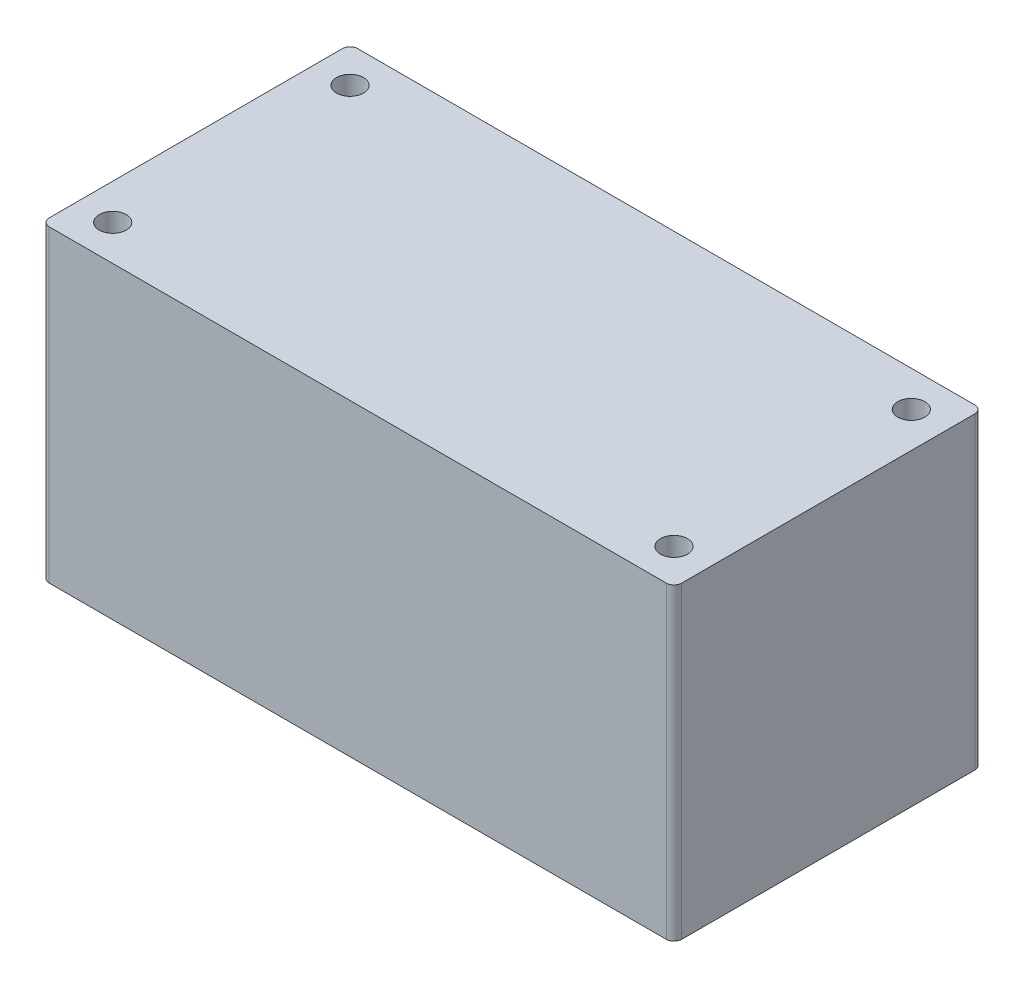
ISO-10303-21;
HEADER;
FILE_DESCRIPTION(('STEP AP214'),'2;1');
FILE_NAME('part.step','',(''),(''),'','','');
FILE_SCHEMA(('AUTOMOTIVE_DESIGN { 1 0 10303 214 1 1 1 1 }'));
ENDSEC;
DATA;
#1=APPLICATION_CONTEXT('core data for automotive mechanical design processes');
#2=APPLICATION_PROTOCOL_DEFINITION('international standard','automotive_design',2000,#1);
#3=PRODUCT_CONTEXT('',#1,'mechanical');
#4=PRODUCT('Part','Part','',(#3));
#5=PRODUCT_RELATED_PRODUCT_CATEGORY('part','',(#4));
#6=PRODUCT_DEFINITION_FORMATION('','',#4);
#7=PRODUCT_DEFINITION_CONTEXT('part definition',#1,'design');
#8=PRODUCT_DEFINITION('design','',#6,#7);
#9=PRODUCT_DEFINITION_SHAPE('','',#8);
#10=(LENGTH_UNIT() NAMED_UNIT(*) SI_UNIT(.MILLI.,.METRE.));
#11=(NAMED_UNIT(*) PLANE_ANGLE_UNIT() SI_UNIT($,.RADIAN.));
#12=(NAMED_UNIT(*) SI_UNIT($,.STERADIAN.) SOLID_ANGLE_UNIT());
#13=UNCERTAINTY_MEASURE_WITH_UNIT(LENGTH_MEASURE(1.E-05),#10,'distance_accuracy_value','');
#14=(GEOMETRIC_REPRESENTATION_CONTEXT(3) GLOBAL_UNCERTAINTY_ASSIGNED_CONTEXT((#13)) GLOBAL_UNIT_ASSIGNED_CONTEXT((#10,
#11,#12)) REPRESENTATION_CONTEXT('',''));
#15=CARTESIAN_POINT('',(0.,0.,0.));
#16=DIRECTION('',(0.,0.,1.));
#17=DIRECTION('',(1.,0.,0.));
#18=AXIS2_PLACEMENT_3D('',#15,#16,#17);
#19=CARTESIAN_POINT('',(20.5,20.,10.));
#20=DIRECTION('',(-1.,0.,0.));
#21=DIRECTION('',(0.,0.,1.));
#22=AXIS2_PLACEMENT_3D('',#19,#20,#21);
#23=PLANE('',#22);
#24=DIRECTION('',(0.,0.,-1.));
#25=VECTOR('',#24,1.);
#26=CARTESIAN_POINT('',(20.5,0.,10.));
#27=LINE('',#26,#25);
#28=CARTESIAN_POINT('',(20.5,0.,9.50000000000001));
#29=VERTEX_POINT('',#28);
#30=CARTESIAN_POINT('',(20.5,0.,-9.5));
#31=VERTEX_POINT('',#30);
#32=EDGE_CURVE('E134',#29,#31,#27,.T.);
#33=ORIENTED_EDGE('',*,*,#32,.T.);
#34=DIRECTION('',(0.,-1.,0.));
#35=VECTOR('',#34,1.);
#36=CARTESIAN_POINT('',(20.5,20.,-9.5));
#37=LINE('',#36,#35);
#38=CARTESIAN_POINT('',(20.5,20.,-9.5));
#39=VERTEX_POINT('',#38);
#40=EDGE_CURVE('E157',#31,#39,#37,.F.);
#41=ORIENTED_EDGE('',*,*,#40,.T.);
#42=DIRECTION('',(0.,0.,-1.));
#43=VECTOR('',#42,1.);
#44=CARTESIAN_POINT('',(20.5,20.,10.));
#45=LINE('',#44,#43);
#46=CARTESIAN_POINT('',(20.5,20.,9.50000000000001));
#47=VERTEX_POINT('',#46);
#48=EDGE_CURVE('E132',#47,#39,#45,.T.);
#49=ORIENTED_EDGE('',*,*,#48,.F.);
#50=DIRECTION('',(0.,-1.,0.));
#51=VECTOR('',#50,1.);
#52=CARTESIAN_POINT('',(20.5,20.,9.50000000000001));
#53=LINE('',#52,#51);
#54=EDGE_CURVE('E154',#47,#29,#53,.T.);
#55=ORIENTED_EDGE('',*,*,#54,.T.);
#56=EDGE_LOOP('',(#33,#41,#49,#55));
#57=FACE_BOUND('',#56,.T.);
#58=ADVANCED_FACE('F39',(#57),#23,.F.);
#59=CARTESIAN_POINT('',(-20.5,20.,-10.));
#60=DIRECTION('',(0.,0.,1.));
#61=DIRECTION('',(1.,0.,0.));
#62=AXIS2_PLACEMENT_3D('',#59,#60,#61);
#63=PLANE('',#62);
#64=DIRECTION('',(-1.,0.,0.));
#65=VECTOR('',#64,1.);
#66=CARTESIAN_POINT('',(-20.5,0.,-10.));
#67=LINE('',#66,#65);
#68=CARTESIAN_POINT('',(20.,0.,-10.));
#69=VERTEX_POINT('',#68);
#70=CARTESIAN_POINT('',(-20.,0.,-10.));
#71=VERTEX_POINT('',#70);
#72=EDGE_CURVE('E130',#69,#71,#67,.T.);
#73=ORIENTED_EDGE('',*,*,#72,.T.);
#74=DIRECTION('',(0.,-1.,0.));
#75=VECTOR('',#74,1.);
#76=CARTESIAN_POINT('',(-20.,20.,-10.));
#77=LINE('',#76,#75);
#78=CARTESIAN_POINT('',(-20.,20.,-10.));
#79=VERTEX_POINT('',#78);
#80=EDGE_CURVE('E109',#71,#79,#77,.F.);
#81=ORIENTED_EDGE('',*,*,#80,.T.);
#82=DIRECTION('',(-1.,0.,0.));
#83=VECTOR('',#82,1.);
#84=CARTESIAN_POINT('',(-20.5,20.,-10.));
#85=LINE('',#84,#83);
#86=CARTESIAN_POINT('',(20.,20.,-10.));
#87=VERTEX_POINT('',#86);
#88=EDGE_CURVE('E173',#87,#79,#85,.T.);
#89=ORIENTED_EDGE('',*,*,#88,.F.);
#90=DIRECTION('',(0.,-1.,0.));
#91=VECTOR('',#90,1.);
#92=CARTESIAN_POINT('',(20.,20.,-10.));
#93=LINE('',#92,#91);
#94=EDGE_CURVE('E114',#87,#69,#93,.T.);
#95=ORIENTED_EDGE('',*,*,#94,.T.);
#96=EDGE_LOOP('',(#73,#81,#89,#95));
#97=FACE_BOUND('',#96,.T.);
#98=ADVANCED_FACE('F225',(#97),#63,.F.);
#99=CARTESIAN_POINT('',(-20.5,20.,10.));
#100=DIRECTION('',(1.,0.,0.));
#101=DIRECTION('',(0.,0.,-1.));
#102=AXIS2_PLACEMENT_3D('',#99,#100,#101);
#103=PLANE('',#102);
#104=DIRECTION('',(0.,0.,1.));
#105=VECTOR('',#104,1.);
#106=CARTESIAN_POINT('',(-20.5,20.,10.));
#107=LINE('',#106,#105);
#108=CARTESIAN_POINT('',(-20.5,20.,-9.5));
#109=VERTEX_POINT('',#108);
#110=CARTESIAN_POINT('',(-20.5,20.,9.50000000000001));
#111=VERTEX_POINT('',#110);
#112=EDGE_CURVE('E123',#109,#111,#107,.T.);
#113=ORIENTED_EDGE('',*,*,#112,.F.);
#114=DIRECTION('',(0.,-1.,0.));
#115=VECTOR('',#114,1.);
#116=CARTESIAN_POINT('',(-20.5,20.,-9.5));
#117=LINE('',#116,#115);
#118=CARTESIAN_POINT('',(-20.5,0.,-9.5));
#119=VERTEX_POINT('',#118);
#120=EDGE_CURVE('E108',#109,#119,#117,.T.);
#121=ORIENTED_EDGE('',*,*,#120,.T.);
#122=DIRECTION('',(0.,0.,1.));
#123=VECTOR('',#122,1.);
#124=CARTESIAN_POINT('',(-20.5,0.,10.));
#125=LINE('',#124,#123);
#126=CARTESIAN_POINT('',(-20.5,0.,9.50000000000001));
#127=VERTEX_POINT('',#126);
#128=EDGE_CURVE('E121',#119,#127,#125,.T.);
#129=ORIENTED_EDGE('',*,*,#128,.T.);
#130=DIRECTION('',(0.,-1.,0.));
#131=VECTOR('',#130,1.);
#132=CARTESIAN_POINT('',(-20.5,20.,9.50000000000001));
#133=LINE('',#132,#131);
#134=EDGE_CURVE('E125',#127,#111,#133,.F.);
#135=ORIENTED_EDGE('',*,*,#134,.T.);
#136=EDGE_LOOP('',(#113,#121,#129,#135));
#137=FACE_BOUND('',#136,.T.);
#138=ADVANCED_FACE('F120',(#137),#103,.F.);
#139=CARTESIAN_POINT('',(-20.5,20.,10.));
#140=DIRECTION('',(0.,0.,-1.));
#141=DIRECTION('',(-1.,0.,0.));
#142=AXIS2_PLACEMENT_3D('',#139,#140,#141);
#143=PLANE('',#142);
#144=DIRECTION('',(1.,0.,0.));
#145=VECTOR('',#144,1.);
#146=CARTESIAN_POINT('',(-20.5,0.,10.));
#147=LINE('',#146,#145);
#148=CARTESIAN_POINT('',(-20.,0.,10.));
#149=VERTEX_POINT('',#148);
#150=CARTESIAN_POINT('',(20.,0.,10.));
#151=VERTEX_POINT('',#150);
#152=EDGE_CURVE('E129',#149,#151,#147,.T.);
#153=ORIENTED_EDGE('',*,*,#152,.T.);
#154=DIRECTION('',(0.,-1.,0.));
#155=VECTOR('',#154,1.);
#156=CARTESIAN_POINT('',(20.,20.,10.));
#157=LINE('',#156,#155);
#158=CARTESIAN_POINT('',(20.,20.,10.));
#159=VERTEX_POINT('',#158);
#160=EDGE_CURVE('E11',#151,#159,#157,.F.);
#161=ORIENTED_EDGE('',*,*,#160,.T.);
#162=DIRECTION('',(1.,0.,0.));
#163=VECTOR('',#162,1.);
#164=CARTESIAN_POINT('',(-20.5,20.,10.));
#165=LINE('',#164,#163);
#166=CARTESIAN_POINT('',(-20.,20.,10.));
#167=VERTEX_POINT('',#166);
#168=EDGE_CURVE('E138',#167,#159,#165,.T.);
#169=ORIENTED_EDGE('',*,*,#168,.F.);
#170=DIRECTION('',(0.,-1.,0.));
#171=VECTOR('',#170,1.);
#172=CARTESIAN_POINT('',(-20.,20.,10.));
#173=LINE('',#172,#171);
#174=EDGE_CURVE('E47',#167,#149,#173,.T.);
#175=ORIENTED_EDGE('',*,*,#174,.T.);
#176=EDGE_LOOP('',(#153,#161,#169,#175));
#177=FACE_BOUND('',#176,.T.);
#178=ADVANCED_FACE('F160',(#177),#143,.F.);
#179=CARTESIAN_POINT('',(0.,20.,0.));
#180=DIRECTION('',(0.,-1.,0.));
#181=DIRECTION('',(0.,0.,-1.));
#182=AXIS2_PLACEMENT_3D('',#179,#180,#181);
#183=PLANE('',#182);
#184=CARTESIAN_POINT('',(18.1909090909091,20.,7.69090909090909));
#185=DIRECTION('',(0.,1.,0.));
#186=DIRECTION('',(0.,0.,1.));
#187=AXIS2_PLACEMENT_3D('',#184,#185,#186);
#188=CIRCLE('',#187,0.875000000000002);
#189=CARTESIAN_POINT('',(18.1909090909091,20.,8.56590909090909));
#190=VERTEX_POINT('',#189);
#191=EDGE_CURVE('E196',#190,#190,#188,.T.);
#192=ORIENTED_EDGE('',*,*,#191,.F.);
#193=EDGE_LOOP('',(#192));
#194=FACE_BOUND('',#193,.T.);
#195=CARTESIAN_POINT('',(-18.1909090909091,20.,-7.69090909090909));
#196=DIRECTION('',(0.,1.,0.));
#197=DIRECTION('',(0.,0.,1.));
#198=AXIS2_PLACEMENT_3D('',#195,#196,#197);
#199=CIRCLE('',#198,0.875000000000002);
#200=CARTESIAN_POINT('',(-18.1909090909091,20.,-6.81590909090909));
#201=VERTEX_POINT('',#200);
#202=EDGE_CURVE('E189',#201,#201,#199,.T.);
#203=ORIENTED_EDGE('',*,*,#202,.F.);
#204=EDGE_LOOP('',(#203));
#205=FACE_BOUND('',#204,.T.);
#206=CARTESIAN_POINT('',(-18.1909090909091,20.,7.69090909090909));
#207=DIRECTION('',(0.,1.,0.));
#208=DIRECTION('',(0.,0.,1.));
#209=AXIS2_PLACEMENT_3D('',#206,#207,#208);
#210=CIRCLE('',#209,0.875000000000002);
#211=CARTESIAN_POINT('',(-18.1909090909091,20.,8.56590909090909));
#212=VERTEX_POINT('',#211);
#213=EDGE_CURVE('E201',#212,#212,#210,.T.);
#214=ORIENTED_EDGE('',*,*,#213,.F.);
#215=EDGE_LOOP('',(#214));
#216=FACE_BOUND('',#215,.T.);
#217=CARTESIAN_POINT('',(18.1909090909091,20.,-7.69090909090909));
#218=DIRECTION('',(0.,1.,0.));
#219=DIRECTION('',(0.,0.,1.));
#220=AXIS2_PLACEMENT_3D('',#217,#218,#219);
#221=CIRCLE('',#220,0.875000000000002);
#222=CARTESIAN_POINT('',(18.1909090909091,20.,-6.81590909090909));
#223=VERTEX_POINT('',#222);
#224=EDGE_CURVE('E178',#223,#223,#221,.T.);
#225=ORIENTED_EDGE('',*,*,#224,.F.);
#226=EDGE_LOOP('',(#225));
#227=FACE_BOUND('',#226,.T.);
#228=ORIENTED_EDGE('',*,*,#88,.T.);
#229=CARTESIAN_POINT('',(-20.,20.,-9.5));
#230=DIRECTION('',(0.,-1.,0.));
#231=DIRECTION('',(0.,0.,-1.));
#232=AXIS2_PLACEMENT_3D('',#229,#230,#231);
#233=CIRCLE('',#232,0.5);
#234=EDGE_CURVE('E152',#79,#109,#233,.F.);
#235=ORIENTED_EDGE('',*,*,#234,.T.);
#236=ORIENTED_EDGE('',*,*,#112,.T.);
#237=CARTESIAN_POINT('',(-20.,20.,9.50000000000001));
#238=DIRECTION('',(0.,-1.,0.));
#239=DIRECTION('',(0.,0.,-1.));
#240=AXIS2_PLACEMENT_3D('',#237,#238,#239);
#241=CIRCLE('',#240,0.5);
#242=EDGE_CURVE('E59',#111,#167,#241,.F.);
#243=ORIENTED_EDGE('',*,*,#242,.T.);
#244=ORIENTED_EDGE('',*,*,#168,.T.);
#245=CARTESIAN_POINT('',(20.,20.,9.50000000000001));
#246=DIRECTION('',(0.,-1.,0.));
#247=DIRECTION('',(0.,0.,-1.));
#248=AXIS2_PLACEMENT_3D('',#245,#246,#247);
#249=CIRCLE('',#248,0.5);
#250=EDGE_CURVE('E148',#159,#47,#249,.F.);
#251=ORIENTED_EDGE('',*,*,#250,.T.);
#252=ORIENTED_EDGE('',*,*,#48,.T.);
#253=CARTESIAN_POINT('',(20.,20.,-9.5));
#254=DIRECTION('',(0.,-1.,0.));
#255=DIRECTION('',(0.,0.,-1.));
#256=AXIS2_PLACEMENT_3D('',#253,#254,#255);
#257=CIRCLE('',#256,0.5);
#258=EDGE_CURVE('E150',#39,#87,#257,.F.);
#259=ORIENTED_EDGE('',*,*,#258,.T.);
#260=EDGE_LOOP('',(#228,#235,#236,#243,#244,#251,#252,#259));
#261=FACE_BOUND('',#260,.T.);
#262=ADVANCED_FACE('F216',(#194,#205,#216,#227,#261),#183,.F.);
#263=CARTESIAN_POINT('',(0.,0.,0.));
#264=DIRECTION('',(0.,-1.,0.));
#265=DIRECTION('',(0.,0.,-1.));
#266=AXIS2_PLACEMENT_3D('',#263,#264,#265);
#267=PLANE('',#266);
#268=CARTESIAN_POINT('',(18.1909090909091,0.,7.69090909090909));
#269=DIRECTION('',(0.,1.,0.));
#270=DIRECTION('',(0.,0.,1.));
#271=AXIS2_PLACEMENT_3D('',#268,#269,#270);
#272=CIRCLE('',#271,0.875000000000002);
#273=CARTESIAN_POINT('',(18.1909090909091,0.,8.56590909090909));
#274=VERTEX_POINT('',#273);
#275=EDGE_CURVE('E187',#274,#274,#272,.T.);
#276=ORIENTED_EDGE('',*,*,#275,.T.);
#277=EDGE_LOOP('',(#276));
#278=FACE_BOUND('',#277,.T.);
#279=CARTESIAN_POINT('',(-18.1909090909091,0.,-7.69090909090909));
#280=DIRECTION('',(0.,1.,0.));
#281=DIRECTION('',(0.,0.,1.));
#282=AXIS2_PLACEMENT_3D('',#279,#280,#281);
#283=CIRCLE('',#282,0.875000000000002);
#284=CARTESIAN_POINT('',(-18.1909090909091,0.,-6.81590909090909));
#285=VERTEX_POINT('',#284);
#286=EDGE_CURVE('E192',#285,#285,#283,.T.);
#287=ORIENTED_EDGE('',*,*,#286,.T.);
#288=EDGE_LOOP('',(#287));
#289=FACE_BOUND('',#288,.T.);
#290=CARTESIAN_POINT('',(-18.1909090909091,0.,7.69090909090909));
#291=DIRECTION('',(0.,1.,0.));
#292=DIRECTION('',(0.,0.,1.));
#293=AXIS2_PLACEMENT_3D('',#290,#291,#292);
#294=CIRCLE('',#293,0.875000000000002);
#295=CARTESIAN_POINT('',(-18.1909090909091,0.,8.56590909090909));
#296=VERTEX_POINT('',#295);
#297=EDGE_CURVE('E193',#296,#296,#294,.T.);
#298=ORIENTED_EDGE('',*,*,#297,.T.);
#299=EDGE_LOOP('',(#298));
#300=FACE_BOUND('',#299,.T.);
#301=CARTESIAN_POINT('',(18.1909090909091,0.,-7.69090909090909));
#302=DIRECTION('',(0.,1.,0.));
#303=DIRECTION('',(0.,0.,1.));
#304=AXIS2_PLACEMENT_3D('',#301,#302,#303);
#305=CIRCLE('',#304,0.875000000000002);
#306=CARTESIAN_POINT('',(18.1909090909091,0.,-6.81590909090909));
#307=VERTEX_POINT('',#306);
#308=EDGE_CURVE('E182',#307,#307,#305,.T.);
#309=ORIENTED_EDGE('',*,*,#308,.T.);
#310=EDGE_LOOP('',(#309));
#311=FACE_BOUND('',#310,.T.);
#312=ORIENTED_EDGE('',*,*,#128,.F.);
#313=CARTESIAN_POINT('',(-20.,0.,-9.5));
#314=DIRECTION('',(0.,-1.,0.));
#315=DIRECTION('',(0.,0.,-1.));
#316=AXIS2_PLACEMENT_3D('',#313,#314,#315);
#317=CIRCLE('',#316,0.5);
#318=EDGE_CURVE('E104',#119,#71,#317,.T.);
#319=ORIENTED_EDGE('',*,*,#318,.T.);
#320=ORIENTED_EDGE('',*,*,#72,.F.);
#321=CARTESIAN_POINT('',(20.,0.,-9.5));
#322=DIRECTION('',(0.,-1.,0.));
#323=DIRECTION('',(0.,0.,-1.));
#324=AXIS2_PLACEMENT_3D('',#321,#322,#323);
#325=CIRCLE('',#324,0.5);
#326=EDGE_CURVE('E115',#69,#31,#325,.T.);
#327=ORIENTED_EDGE('',*,*,#326,.T.);
#328=ORIENTED_EDGE('',*,*,#32,.F.);
#329=CARTESIAN_POINT('',(20.,0.,9.50000000000001));
#330=DIRECTION('',(0.,-1.,0.));
#331=DIRECTION('',(0.,0.,-1.));
#332=AXIS2_PLACEMENT_3D('',#329,#330,#331);
#333=CIRCLE('',#332,0.5);
#334=EDGE_CURVE('E141',#29,#151,#333,.T.);
#335=ORIENTED_EDGE('',*,*,#334,.T.);
#336=ORIENTED_EDGE('',*,*,#152,.F.);
#337=CARTESIAN_POINT('',(-20.,0.,9.50000000000001));
#338=DIRECTION('',(0.,-1.,0.));
#339=DIRECTION('',(0.,0.,-1.));
#340=AXIS2_PLACEMENT_3D('',#337,#338,#339);
#341=CIRCLE('',#340,0.5);
#342=EDGE_CURVE('E124',#149,#127,#341,.T.);
#343=ORIENTED_EDGE('',*,*,#342,.T.);
#344=EDGE_LOOP('',(#312,#319,#320,#327,#328,#335,#336,#343));
#345=FACE_BOUND('',#344,.T.);
#346=ADVANCED_FACE('F127',(#278,#289,#300,#311,#345),#267,.T.);
#347=CARTESIAN_POINT('',(-20.,20.,-9.5));
#348=DIRECTION('',(0.,-1.,0.));
#349=DIRECTION('',(0.,0.,-1.));
#350=AXIS2_PLACEMENT_3D('',#347,#348,#349);
#351=CYLINDRICAL_SURFACE('',#350,0.5);
#352=ORIENTED_EDGE('',*,*,#234,.F.);
#353=ORIENTED_EDGE('',*,*,#80,.F.);
#354=ORIENTED_EDGE('',*,*,#318,.F.);
#355=ORIENTED_EDGE('',*,*,#120,.F.);
#356=EDGE_LOOP('',(#352,#353,#354,#355));
#357=FACE_BOUND('',#356,.T.);
#358=ADVANCED_FACE('F107',(#357),#351,.T.);
#359=CARTESIAN_POINT('',(20.,20.,-9.5));
#360=DIRECTION('',(0.,-1.,0.));
#361=DIRECTION('',(0.,0.,-1.));
#362=AXIS2_PLACEMENT_3D('',#359,#360,#361);
#363=CYLINDRICAL_SURFACE('',#362,0.5);
#364=ORIENTED_EDGE('',*,*,#258,.F.);
#365=ORIENTED_EDGE('',*,*,#40,.F.);
#366=ORIENTED_EDGE('',*,*,#326,.F.);
#367=ORIENTED_EDGE('',*,*,#94,.F.);
#368=EDGE_LOOP('',(#364,#365,#366,#367));
#369=FACE_BOUND('',#368,.T.);
#370=ADVANCED_FACE('F227',(#369),#363,.T.);
#371=CARTESIAN_POINT('',(20.,20.,9.50000000000001));
#372=DIRECTION('',(0.,-1.,0.));
#373=DIRECTION('',(0.,0.,-1.));
#374=AXIS2_PLACEMENT_3D('',#371,#372,#373);
#375=CYLINDRICAL_SURFACE('',#374,0.5);
#376=ORIENTED_EDGE('',*,*,#250,.F.);
#377=ORIENTED_EDGE('',*,*,#160,.F.);
#378=ORIENTED_EDGE('',*,*,#334,.F.);
#379=ORIENTED_EDGE('',*,*,#54,.F.);
#380=EDGE_LOOP('',(#376,#377,#378,#379));
#381=FACE_BOUND('',#380,.T.);
#382=ADVANCED_FACE('F167',(#381),#375,.T.);
#383=CARTESIAN_POINT('',(-20.,20.,9.50000000000001));
#384=DIRECTION('',(0.,-1.,0.));
#385=DIRECTION('',(0.,0.,-1.));
#386=AXIS2_PLACEMENT_3D('',#383,#384,#385);
#387=CYLINDRICAL_SURFACE('',#386,0.5);
#388=ORIENTED_EDGE('',*,*,#242,.F.);
#389=ORIENTED_EDGE('',*,*,#134,.F.);
#390=ORIENTED_EDGE('',*,*,#342,.F.);
#391=ORIENTED_EDGE('',*,*,#174,.F.);
#392=EDGE_LOOP('',(#388,#389,#390,#391));
#393=FACE_BOUND('',#392,.T.);
#394=ADVANCED_FACE('F41',(#393),#387,.T.);
#395=CARTESIAN_POINT('',(18.1909090909091,0.,-7.69090909090909));
#396=DIRECTION('',(0.,1.,0.));
#397=DIRECTION('',(0.,0.,1.));
#398=AXIS2_PLACEMENT_3D('',#395,#396,#397);
#399=CYLINDRICAL_SURFACE('',#398,0.875000000000002);
#400=ORIENTED_EDGE('',*,*,#308,.F.);
#401=EDGE_LOOP('',(#400));
#402=FACE_BOUND('',#401,.T.);
#403=ORIENTED_EDGE('',*,*,#224,.T.);
#404=EDGE_LOOP('',(#403));
#405=FACE_BOUND('',#404,.T.);
#406=ADVANCED_FACE('F212',(#402,#405),#399,.F.);
#407=CARTESIAN_POINT('',(-18.1909090909091,0.,7.69090909090909));
#408=DIRECTION('',(0.,1.,0.));
#409=DIRECTION('',(0.,0.,1.));
#410=AXIS2_PLACEMENT_3D('',#407,#408,#409);
#411=CYLINDRICAL_SURFACE('',#410,0.875000000000002);
#412=ORIENTED_EDGE('',*,*,#297,.F.);
#413=EDGE_LOOP('',(#412));
#414=FACE_BOUND('',#413,.T.);
#415=ORIENTED_EDGE('',*,*,#213,.T.);
#416=EDGE_LOOP('',(#415));
#417=FACE_BOUND('',#416,.T.);
#418=ADVANCED_FACE('F208',(#414,#417),#411,.F.);
#419=CARTESIAN_POINT('',(-18.1909090909091,0.,-7.69090909090909));
#420=DIRECTION('',(0.,1.,0.));
#421=DIRECTION('',(0.,0.,1.));
#422=AXIS2_PLACEMENT_3D('',#419,#420,#421);
#423=CYLINDRICAL_SURFACE('',#422,0.875000000000002);
#424=ORIENTED_EDGE('',*,*,#286,.F.);
#425=EDGE_LOOP('',(#424));
#426=FACE_BOUND('',#425,.T.);
#427=ORIENTED_EDGE('',*,*,#202,.T.);
#428=EDGE_LOOP('',(#427));
#429=FACE_BOUND('',#428,.T.);
#430=ADVANCED_FACE('F211',(#426,#429),#423,.F.);
#431=CARTESIAN_POINT('',(18.1909090909091,0.,7.69090909090909));
#432=DIRECTION('',(0.,1.,0.));
#433=DIRECTION('',(0.,0.,1.));
#434=AXIS2_PLACEMENT_3D('',#431,#432,#433);
#435=CYLINDRICAL_SURFACE('',#434,0.875000000000002);
#436=ORIENTED_EDGE('',*,*,#275,.F.);
#437=EDGE_LOOP('',(#436));
#438=FACE_BOUND('',#437,.T.);
#439=ORIENTED_EDGE('',*,*,#191,.T.);
#440=EDGE_LOOP('',(#439));
#441=FACE_BOUND('',#440,.T.);
#442=ADVANCED_FACE('F254',(#438,#441),#435,.F.);
#443=CLOSED_SHELL('',(#58,#98,#138,#178,#262,#346,#358,#370,#382,#394,#406,#418,#430,#442));
#444=MANIFOLD_SOLID_BREP('B2',#443);
#445=ADVANCED_BREP_SHAPE_REPRESENTATION('',(#18,#444),#14);
#446=SHAPE_DEFINITION_REPRESENTATION(#9,#445);
ENDSEC;
END-ISO-10303-21;
